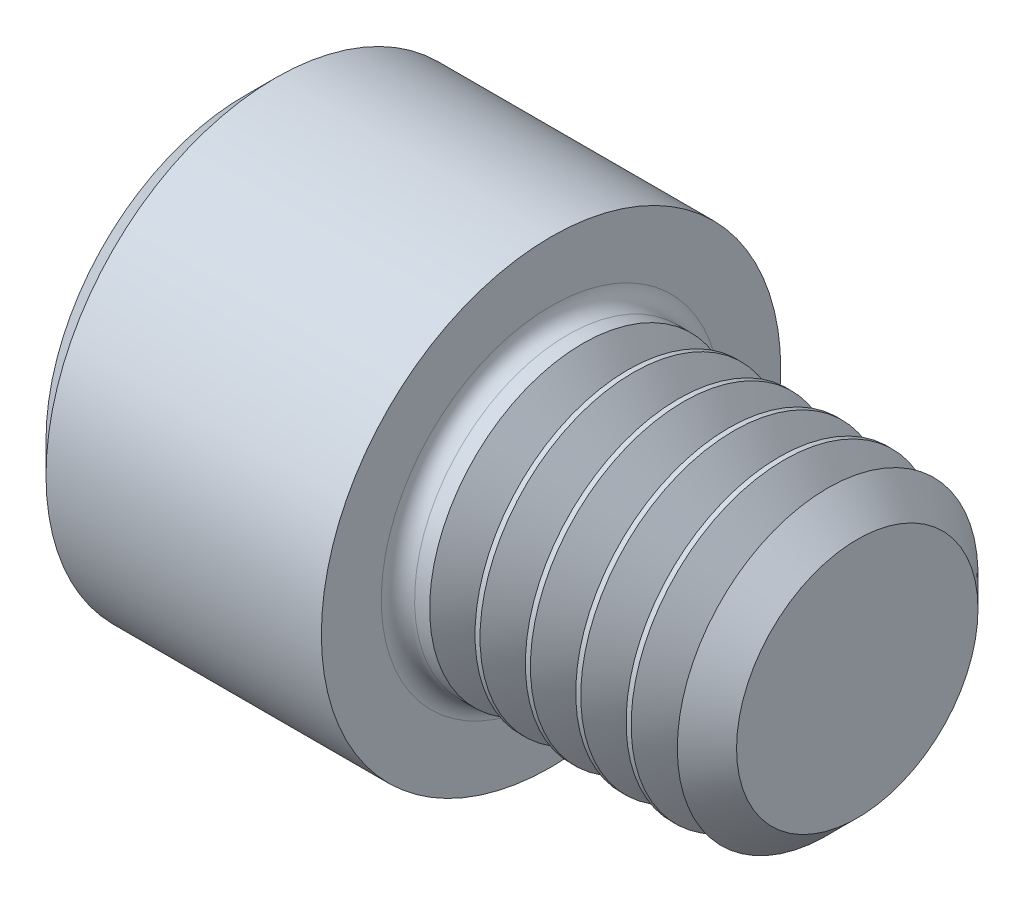
ISO-10303-21;
HEADER;
FILE_DESCRIPTION(('STEP AP214'),'2;1');
FILE_NAME('part.step','',(''),(''),'','','');
FILE_SCHEMA(('AUTOMOTIVE_DESIGN { 1 0 10303 214 1 1 1 1 }'));
ENDSEC;
DATA;
#1=APPLICATION_CONTEXT('core data for automotive mechanical design processes');
#2=APPLICATION_PROTOCOL_DEFINITION('international standard','automotive_design',2000,#1);
#3=PRODUCT_CONTEXT('',#1,'mechanical');
#4=PRODUCT('Part','Part','',(#3));
#5=PRODUCT_RELATED_PRODUCT_CATEGORY('part','',(#4));
#6=PRODUCT_DEFINITION_FORMATION('','',#4);
#7=PRODUCT_DEFINITION_CONTEXT('part definition',#1,'design');
#8=PRODUCT_DEFINITION('design','',#6,#7);
#9=PRODUCT_DEFINITION_SHAPE('','',#8);
#10=(LENGTH_UNIT() NAMED_UNIT(*) SI_UNIT(.MILLI.,.METRE.));
#11=(NAMED_UNIT(*) PLANE_ANGLE_UNIT() SI_UNIT($,.RADIAN.));
#12=(NAMED_UNIT(*) SI_UNIT($,.STERADIAN.) SOLID_ANGLE_UNIT());
#13=UNCERTAINTY_MEASURE_WITH_UNIT(LENGTH_MEASURE(1.E-05),#10,'distance_accuracy_value','');
#14=(GEOMETRIC_REPRESENTATION_CONTEXT(3) GLOBAL_UNCERTAINTY_ASSIGNED_CONTEXT((#13)) GLOBAL_UNIT_ASSIGNED_CONTEXT((#10,
#11,#12)) REPRESENTATION_CONTEXT('',''));
#15=CARTESIAN_POINT('',(0.,0.,0.));
#16=DIRECTION('',(0.,0.,1.));
#17=DIRECTION('',(1.,0.,0.));
#18=AXIS2_PLACEMENT_3D('',#15,#16,#17);
#19=CARTESIAN_POINT('',(0.,0.,0.));
#20=DIRECTION('',(-1.,0.,0.));
#21=DIRECTION('',(0.,0.,1.));
#22=AXIS2_PLACEMENT_3D('',#19,#20,#21);
#23=PLANE('',#22);
#24=DIRECTION('',(0.,-0.499999999999999,0.866025403784439));
#25=VECTOR('',#24,1.);
#26=CARTESIAN_POINT('',(0.,3.66617420935413,0.));
#27=LINE('',#26,#25);
#28=CARTESIAN_POINT('',(0.,3.66617420935413,0.));
#29=VERTEX_POINT('',#28);
#30=CARTESIAN_POINT('',(0.,1.83308710467707,3.175));
#31=VERTEX_POINT('',#30);
#32=EDGE_CURVE('E308',#29,#31,#27,.T.);
#33=ORIENTED_EDGE('',*,*,#32,.T.);
#34=DIRECTION('',(0.,1.,0.));
#35=VECTOR('',#34,1.);
#36=CARTESIAN_POINT('',(0.,-1.83308710467705,3.175));
#37=LINE('',#36,#35);
#38=CARTESIAN_POINT('',(0.,-1.83308710467705,3.175));
#39=VERTEX_POINT('',#38);
#40=EDGE_CURVE('E127',#39,#31,#37,.T.);
#41=ORIENTED_EDGE('',*,*,#40,.F.);
#42=DIRECTION('',(0.,-0.500000000000001,-0.866025403784438));
#43=VECTOR('',#42,1.);
#44=CARTESIAN_POINT('',(0.,-1.83308710467705,3.175));
#45=LINE('',#44,#43);
#46=CARTESIAN_POINT('',(0.,-3.66617420935412,0.));
#47=VERTEX_POINT('',#46);
#48=EDGE_CURVE('E329',#39,#47,#45,.T.);
#49=ORIENTED_EDGE('',*,*,#48,.T.);
#50=DIRECTION('',(0.,0.499999999999999,-0.866025403784439));
#51=VECTOR('',#50,1.);
#52=CARTESIAN_POINT('',(0.,-3.66617420935412,0.));
#53=LINE('',#52,#51);
#54=CARTESIAN_POINT('',(0.,-1.83308710467706,-3.175));
#55=VERTEX_POINT('',#54);
#56=EDGE_CURVE('E332',#47,#55,#53,.T.);
#57=ORIENTED_EDGE('',*,*,#56,.T.);
#58=DIRECTION('',(0.,-1.,0.));
#59=VECTOR('',#58,1.);
#60=CARTESIAN_POINT('',(0.,1.83308710467706,-3.175));
#61=LINE('',#60,#59);
#62=CARTESIAN_POINT('',(0.,1.83308710467706,-3.175));
#63=VERTEX_POINT('',#62);
#64=EDGE_CURVE('E335',#63,#55,#61,.T.);
#65=ORIENTED_EDGE('',*,*,#64,.F.);
#66=DIRECTION('',(0.,-0.500000000000001,-0.866025403784438));
#67=VECTOR('',#66,1.);
#68=CARTESIAN_POINT('',(0.,3.66617420935413,0.));
#69=LINE('',#68,#67);
#70=EDGE_CURVE('E122',#29,#63,#69,.T.);
#71=ORIENTED_EDGE('',*,*,#70,.F.);
#72=EDGE_LOOP('',(#33,#41,#49,#57,#65,#71));
#73=FACE_BOUND('',#72,.T.);
#74=CARTESIAN_POINT('',(0.,0.,0.));
#75=DIRECTION('',(-1.,0.,0.));
#76=DIRECTION('',(0.,0.,1.));
#77=AXIS2_PLACEMENT_3D('',#74,#75,#76);
#78=CIRCLE('',#77,5.15366);
#79=CARTESIAN_POINT('',(0.,0.,5.15366));
#80=VERTEX_POINT('',#79);
#81=EDGE_CURVE('E148',#80,#80,#78,.T.);
#82=ORIENTED_EDGE('',*,*,#81,.T.);
#83=EDGE_LOOP('',(#82));
#84=FACE_BOUND('',#83,.T.);
#85=ADVANCED_FACE('F34',(#73,#84),#23,.T.);
#86=CARTESIAN_POINT('',(0.,0.,0.));
#87=DIRECTION('',(1.,0.,0.));
#88=DIRECTION('',(0.,0.,-1.));
#89=AXIS2_PLACEMENT_3D('',#86,#87,#88);
#90=CONICAL_SURFACE('',#89,5.15366,0.785398163397447);
#91=CARTESIAN_POINT('',(0.800099999999998,0.,0.));
#92=DIRECTION('',(-1.,0.,0.));
#93=DIRECTION('',(0.,0.,1.));
#94=AXIS2_PLACEMENT_3D('',#91,#92,#93);
#95=CIRCLE('',#94,5.95376);
#96=CARTESIAN_POINT('',(0.800099999999998,0.,5.95376));
#97=VERTEX_POINT('',#96);
#98=EDGE_CURVE('E145',#97,#97,#95,.T.);
#99=ORIENTED_EDGE('',*,*,#98,.T.);
#100=EDGE_LOOP('',(#99));
#101=FACE_BOUND('',#100,.T.);
#102=ORIENTED_EDGE('',*,*,#81,.F.);
#103=EDGE_LOOP('',(#102));
#104=FACE_BOUND('',#103,.T.);
#105=ADVANCED_FACE('F171',(#101,#104),#90,.T.);
#106=CARTESIAN_POINT('',(-31.75,0.,0.));
#107=DIRECTION('',(-1.,0.,0.));
#108=DIRECTION('',(0.,0.,1.));
#109=AXIS2_PLACEMENT_3D('',#106,#107,#108);
#110=CYLINDRICAL_SURFACE('',#109,5.95376);
#111=CARTESIAN_POINT('',(7.9375,0.,0.));
#112=DIRECTION('',(-1.,0.,0.));
#113=DIRECTION('',(0.,0.,1.));
#114=AXIS2_PLACEMENT_3D('',#111,#112,#113);
#115=CIRCLE('',#114,5.95376);
#116=CARTESIAN_POINT('',(7.9375,0.,5.95376));
#117=VERTEX_POINT('',#116);
#118=EDGE_CURVE('E142',#117,#117,#115,.T.);
#119=ORIENTED_EDGE('',*,*,#118,.T.);
#120=EDGE_LOOP('',(#119));
#121=FACE_BOUND('',#120,.T.);
#122=ORIENTED_EDGE('',*,*,#98,.F.);
#123=EDGE_LOOP('',(#122));
#124=FACE_BOUND('',#123,.T.);
#125=ADVANCED_FACE('F176',(#121,#124),#110,.T.);
#126=CARTESIAN_POINT('',(7.9375,5.95376,0.));
#127=DIRECTION('',(1.,0.,0.));
#128=DIRECTION('',(0.,0.,-1.));
#129=AXIS2_PLACEMENT_3D('',#126,#127,#128);
#130=PLANE('',#129);
#131=CARTESIAN_POINT('',(7.9375,0.,0.));
#132=DIRECTION('',(1.,0.,0.));
#133=DIRECTION('',(0.,0.,-1.));
#134=AXIS2_PLACEMENT_3D('',#131,#132,#133);
#135=CIRCLE('',#134,4.40054999999998);
#136=CARTESIAN_POINT('',(7.9375,0.,-4.40054999999998));
#137=VERTEX_POINT('',#136);
#138=EDGE_CURVE('E43',#137,#137,#135,.F.);
#139=ORIENTED_EDGE('',*,*,#138,.T.);
#140=EDGE_LOOP('',(#139));
#141=FACE_BOUND('',#140,.T.);
#142=ORIENTED_EDGE('',*,*,#118,.F.);
#143=EDGE_LOOP('',(#142));
#144=FACE_BOUND('',#143,.T.);
#145=ADVANCED_FACE('F154',(#141,#144),#130,.T.);
#146=CARTESIAN_POINT('',(-31.75,0.,0.));
#147=DIRECTION('',(-1.,0.,0.));
#148=DIRECTION('',(0.,0.,1.));
#149=AXIS2_PLACEMENT_3D('',#146,#147,#148);
#150=CYLINDRICAL_SURFACE('',#149,3.96874999999998);
#151=CARTESIAN_POINT('',(8.75939677789909,0.,0.));
#152=DIRECTION('',(-1.,0.,0.));
#153=DIRECTION('',(0.,-1.,0.));
#154=AXIS2_PLACEMENT_3D('',#151,#152,#153);
#155=CIRCLE('',#154,3.96875);
#156=CARTESIAN_POINT('',(8.75939677789909,-3.96875,0.));
#157=VERTEX_POINT('',#156);
#158=EDGE_CURVE('E303',#157,#157,#155,.T.);
#159=ORIENTED_EDGE('',*,*,#158,.T.);
#160=EDGE_LOOP('',(#159));
#161=FACE_BOUND('',#160,.T.);
#162=CARTESIAN_POINT('',(8.3693,0.,0.));
#163=DIRECTION('',(1.,0.,0.));
#164=DIRECTION('',(0.,0.,-1.));
#165=AXIS2_PLACEMENT_3D('',#162,#163,#164);
#166=CIRCLE('',#165,3.96874999999998);
#167=CARTESIAN_POINT('',(8.3693,0.,-3.96874999999998));
#168=VERTEX_POINT('',#167);
#169=EDGE_CURVE('E11',#168,#168,#166,.T.);
#170=ORIENTED_EDGE('',*,*,#169,.T.);
#171=EDGE_LOOP('',(#170));
#172=FACE_BOUND('',#171,.T.);
#173=ADVANCED_FACE('F158',(#161,#172),#150,.T.);
#174=CARTESIAN_POINT('',(8.3693,0.,0.));
#175=DIRECTION('',(1.,0.,0.));
#176=DIRECTION('',(0.,0.,-1.));
#177=AXIS2_PLACEMENT_3D('',#174,#175,#176);
#178=TOROIDAL_SURFACE('',#177,4.40054999999998,0.4318);
#179=ORIENTED_EDGE('',*,*,#169,.F.);
#180=EDGE_LOOP('',(#179));
#181=FACE_BOUND('',#180,.T.);
#182=ORIENTED_EDGE('',*,*,#138,.F.);
#183=EDGE_LOOP('',(#182));
#184=FACE_BOUND('',#183,.T.);
#185=ADVANCED_FACE('F36',(#181,#184),#178,.F.);
#186=CARTESIAN_POINT('',(3.8354,3.66617420935413,0.));
#187=DIRECTION('',(0.,-0.86602540378444,-0.499999999999999));
#188=DIRECTION('',(0.,0.499999999999999,-0.86602540378444));
#189=AXIS2_PLACEMENT_3D('',#186,#187,#188);
#190=PLANE('',#189);
#191=ORIENTED_EDGE('',*,*,#32,.F.);
#192=DIRECTION('',(-1.,0.,0.));
#193=VECTOR('',#192,1.);
#194=CARTESIAN_POINT('',(3.8354,3.66617420935413,0.));
#195=LINE('',#194,#193);
#196=CARTESIAN_POINT('',(3.8354,3.66617420935413,0.));
#197=VERTEX_POINT('',#196);
#198=EDGE_CURVE('E326',#197,#29,#195,.T.);
#199=ORIENTED_EDGE('',*,*,#198,.F.);
#200=DIRECTION('',(0.,-0.499999999999999,0.866025403784439));
#201=VECTOR('',#200,1.);
#202=CARTESIAN_POINT('',(3.8354,3.66617420935413,0.));
#203=LINE('',#202,#201);
#204=CARTESIAN_POINT('',(3.8354,2.7496306570156,1.5875));
#205=VERTEX_POINT('',#204);
#206=EDGE_CURVE('E50',#197,#205,#203,.T.);
#207=ORIENTED_EDGE('',*,*,#206,.T.);
#208=CARTESIAN_POINT('',(3.8354,1.83308710467707,3.175));
#209=VERTEX_POINT('',#208);
#210=EDGE_CURVE('E108',#205,#209,#203,.T.);
#211=ORIENTED_EDGE('',*,*,#210,.T.);
#212=DIRECTION('',(-1.,0.,0.));
#213=VECTOR('',#212,1.);
#214=CARTESIAN_POINT('',(3.8354,1.83308710467707,3.175));
#215=LINE('',#214,#213);
#216=EDGE_CURVE('E120',#209,#31,#215,.T.);
#217=ORIENTED_EDGE('',*,*,#216,.T.);
#218=EDGE_LOOP('',(#191,#199,#207,#211,#217));
#219=FACE_BOUND('',#218,.T.);
#220=ADVANCED_FACE('F119',(#219),#190,.T.);
#221=CARTESIAN_POINT('',(3.8354,-1.83308710467705,3.175));
#222=DIRECTION('',(0.,0.,1.));
#223=DIRECTION('',(0.,-1.,0.));
#224=AXIS2_PLACEMENT_3D('',#221,#222,#223);
#225=PLANE('',#224);
#226=ORIENTED_EDGE('',*,*,#40,.T.);
#227=ORIENTED_EDGE('',*,*,#216,.F.);
#228=DIRECTION('',(0.,1.,0.));
#229=VECTOR('',#228,1.);
#230=CARTESIAN_POINT('',(3.8354,-1.83308710467705,3.175));
#231=LINE('',#230,#229);
#232=CARTESIAN_POINT('',(3.8354,0.,3.175));
#233=VERTEX_POINT('',#232);
#234=EDGE_CURVE('E106',#233,#209,#231,.T.);
#235=ORIENTED_EDGE('',*,*,#234,.F.);
#236=CARTESIAN_POINT('',(3.8354,-1.83308710467705,3.175));
#237=VERTEX_POINT('',#236);
#238=EDGE_CURVE('E116',#237,#233,#231,.T.);
#239=ORIENTED_EDGE('',*,*,#238,.F.);
#240=DIRECTION('',(-1.,0.,0.));
#241=VECTOR('',#240,1.);
#242=CARTESIAN_POINT('',(3.8354,-1.83308710467705,3.175));
#243=LINE('',#242,#241);
#244=EDGE_CURVE('E129',#237,#39,#243,.T.);
#245=ORIENTED_EDGE('',*,*,#244,.T.);
#246=EDGE_LOOP('',(#226,#227,#235,#239,#245));
#247=FACE_BOUND('',#246,.T.);
#248=ADVANCED_FACE('F124',(#247),#225,.F.);
#249=CARTESIAN_POINT('',(3.8354,-1.83308710467705,3.175));
#250=DIRECTION('',(0.,0.866025403784438,-0.500000000000001));
#251=DIRECTION('',(0.,0.500000000000001,0.866025403784438));
#252=AXIS2_PLACEMENT_3D('',#249,#250,#251);
#253=PLANE('',#252);
#254=ORIENTED_EDGE('',*,*,#48,.F.);
#255=ORIENTED_EDGE('',*,*,#244,.F.);
#256=DIRECTION('',(0.,-0.500000000000001,-0.866025403784438));
#257=VECTOR('',#256,1.);
#258=CARTESIAN_POINT('',(3.8354,-1.83308710467705,3.175));
#259=LINE('',#258,#257);
#260=CARTESIAN_POINT('',(3.8354,-2.74963065701559,1.5875));
#261=VERTEX_POINT('',#260);
#262=EDGE_CURVE('E311',#237,#261,#259,.T.);
#263=ORIENTED_EDGE('',*,*,#262,.T.);
#264=CARTESIAN_POINT('',(3.8354,-3.66617420935412,0.));
#265=VERTEX_POINT('',#264);
#266=EDGE_CURVE('E310',#261,#265,#259,.T.);
#267=ORIENTED_EDGE('',*,*,#266,.T.);
#268=DIRECTION('',(-1.,0.,0.));
#269=VECTOR('',#268,1.);
#270=CARTESIAN_POINT('',(3.8354,-3.66617420935412,0.));
#271=LINE('',#270,#269);
#272=EDGE_CURVE('E134',#265,#47,#271,.T.);
#273=ORIENTED_EDGE('',*,*,#272,.T.);
#274=EDGE_LOOP('',(#254,#255,#263,#267,#273));
#275=FACE_BOUND('',#274,.T.);
#276=ADVANCED_FACE('F201',(#275),#253,.T.);
#277=CARTESIAN_POINT('',(3.8354,-3.66617420935412,0.));
#278=DIRECTION('',(0.,0.866025403784439,0.499999999999999));
#279=DIRECTION('',(0.,-0.499999999999999,0.866025403784439));
#280=AXIS2_PLACEMENT_3D('',#277,#278,#279);
#281=PLANE('',#280);
#282=ORIENTED_EDGE('',*,*,#56,.F.);
#283=ORIENTED_EDGE('',*,*,#272,.F.);
#284=DIRECTION('',(0.,0.499999999999999,-0.866025403784439));
#285=VECTOR('',#284,1.);
#286=CARTESIAN_POINT('',(3.8354,-3.66617420935412,0.));
#287=LINE('',#286,#285);
#288=CARTESIAN_POINT('',(3.8354,-2.74963065701559,-1.58749999999999));
#289=VERTEX_POINT('',#288);
#290=EDGE_CURVE('E315',#265,#289,#287,.T.);
#291=ORIENTED_EDGE('',*,*,#290,.T.);
#292=CARTESIAN_POINT('',(3.8354,-1.83308710467706,-3.175));
#293=VERTEX_POINT('',#292);
#294=EDGE_CURVE('E314',#289,#293,#287,.T.);
#295=ORIENTED_EDGE('',*,*,#294,.T.);
#296=DIRECTION('',(-1.,0.,0.));
#297=VECTOR('',#296,1.);
#298=CARTESIAN_POINT('',(3.8354,-1.83308710467706,-3.175));
#299=LINE('',#298,#297);
#300=EDGE_CURVE('E344',#293,#55,#299,.T.);
#301=ORIENTED_EDGE('',*,*,#300,.T.);
#302=EDGE_LOOP('',(#282,#283,#291,#295,#301));
#303=FACE_BOUND('',#302,.T.);
#304=ADVANCED_FACE('F204',(#303),#281,.T.);
#305=CARTESIAN_POINT('',(3.8354,1.83308710467706,-3.175));
#306=DIRECTION('',(0.,0.,-1.));
#307=DIRECTION('',(0.,1.,0.));
#308=AXIS2_PLACEMENT_3D('',#305,#306,#307);
#309=PLANE('',#308);
#310=ORIENTED_EDGE('',*,*,#64,.T.);
#311=ORIENTED_EDGE('',*,*,#300,.F.);
#312=DIRECTION('',(0.,-1.,0.));
#313=VECTOR('',#312,1.);
#314=CARTESIAN_POINT('',(3.8354,1.83308710467706,-3.175));
#315=LINE('',#314,#313);
#316=CARTESIAN_POINT('',(3.8354,0.,-3.175));
#317=VERTEX_POINT('',#316);
#318=EDGE_CURVE('E318',#317,#293,#315,.T.);
#319=ORIENTED_EDGE('',*,*,#318,.F.);
#320=CARTESIAN_POINT('',(3.8354,1.83308710467706,-3.175));
#321=VERTEX_POINT('',#320);
#322=EDGE_CURVE('E319',#321,#317,#315,.T.);
#323=ORIENTED_EDGE('',*,*,#322,.F.);
#324=DIRECTION('',(-1.,0.,0.));
#325=VECTOR('',#324,1.);
#326=CARTESIAN_POINT('',(3.8354,1.83308710467706,-3.175));
#327=LINE('',#326,#325);
#328=EDGE_CURVE('E341',#321,#63,#327,.T.);
#329=ORIENTED_EDGE('',*,*,#328,.T.);
#330=EDGE_LOOP('',(#310,#311,#319,#323,#329));
#331=FACE_BOUND('',#330,.T.);
#332=ADVANCED_FACE('F208',(#331),#309,.F.);
#333=CARTESIAN_POINT('',(3.8354,3.66617420935413,0.));
#334=DIRECTION('',(0.,0.866025403784438,-0.500000000000001));
#335=DIRECTION('',(0.,0.500000000000001,0.866025403784438));
#336=AXIS2_PLACEMENT_3D('',#333,#334,#335);
#337=PLANE('',#336);
#338=ORIENTED_EDGE('',*,*,#70,.T.);
#339=ORIENTED_EDGE('',*,*,#328,.F.);
#340=DIRECTION('',(0.,-0.500000000000001,-0.866025403784438));
#341=VECTOR('',#340,1.);
#342=CARTESIAN_POINT('',(3.8354,3.66617420935413,0.));
#343=LINE('',#342,#341);
#344=CARTESIAN_POINT('',(3.8354,2.74963065701559,-1.58750000000001));
#345=VERTEX_POINT('',#344);
#346=EDGE_CURVE('E322',#345,#321,#343,.T.);
#347=ORIENTED_EDGE('',*,*,#346,.F.);
#348=EDGE_CURVE('E323',#197,#345,#343,.T.);
#349=ORIENTED_EDGE('',*,*,#348,.F.);
#350=ORIENTED_EDGE('',*,*,#198,.T.);
#351=EDGE_LOOP('',(#338,#339,#347,#349,#350));
#352=FACE_BOUND('',#351,.T.);
#353=ADVANCED_FACE('F212',(#352),#337,.F.);
#354=CARTESIAN_POINT('',(3.8354,1.83308710467707,3.175));
#355=DIRECTION('',(-1.,0.,0.));
#356=DIRECTION('',(0.,0.,1.));
#357=AXIS2_PLACEMENT_3D('',#354,#355,#356);
#358=PLANE('',#357);
#359=CARTESIAN_POINT('',(3.8354,0.,0.));
#360=DIRECTION('',(-1.,0.,0.));
#361=DIRECTION('',(0.,0.,1.));
#362=AXIS2_PLACEMENT_3D('',#359,#360,#361);
#363=CIRCLE('',#362,3.175);
#364=EDGE_CURVE('E128',#261,#233,#363,.T.);
#365=ORIENTED_EDGE('',*,*,#364,.F.);
#366=ORIENTED_EDGE('',*,*,#262,.F.);
#367=ORIENTED_EDGE('',*,*,#238,.T.);
#368=EDGE_LOOP('',(#365,#366,#367));
#369=FACE_BOUND('',#368,.T.);
#370=ADVANCED_FACE('F216',(#369),#358,.T.);
#371=EDGE_CURVE('E132',#289,#261,#363,.T.);
#372=ORIENTED_EDGE('',*,*,#371,.F.);
#373=ORIENTED_EDGE('',*,*,#290,.F.);
#374=ORIENTED_EDGE('',*,*,#266,.F.);
#375=EDGE_LOOP('',(#372,#373,#374));
#376=FACE_BOUND('',#375,.T.);
#377=ADVANCED_FACE('F220',(#376),#358,.T.);
#378=EDGE_CURVE('E364',#317,#289,#363,.T.);
#379=ORIENTED_EDGE('',*,*,#378,.F.);
#380=ORIENTED_EDGE('',*,*,#318,.T.);
#381=ORIENTED_EDGE('',*,*,#294,.F.);
#382=EDGE_LOOP('',(#379,#380,#381));
#383=FACE_BOUND('',#382,.T.);
#384=ADVANCED_FACE('F370',(#383),#358,.T.);
#385=EDGE_CURVE('E361',#345,#317,#363,.T.);
#386=ORIENTED_EDGE('',*,*,#385,.F.);
#387=ORIENTED_EDGE('',*,*,#346,.T.);
#388=ORIENTED_EDGE('',*,*,#322,.T.);
#389=EDGE_LOOP('',(#386,#387,#388));
#390=FACE_BOUND('',#389,.T.);
#391=ADVANCED_FACE('F359',(#390),#358,.T.);
#392=EDGE_CURVE('E139',#205,#345,#363,.T.);
#393=ORIENTED_EDGE('',*,*,#392,.F.);
#394=ORIENTED_EDGE('',*,*,#206,.F.);
#395=ORIENTED_EDGE('',*,*,#348,.T.);
#396=EDGE_LOOP('',(#393,#394,#395));
#397=FACE_BOUND('',#396,.T.);
#398=ADVANCED_FACE('F353',(#397),#358,.T.);
#399=EDGE_CURVE('E111',#233,#205,#363,.T.);
#400=ORIENTED_EDGE('',*,*,#399,.F.);
#401=ORIENTED_EDGE('',*,*,#234,.T.);
#402=ORIENTED_EDGE('',*,*,#210,.F.);
#403=EDGE_LOOP('',(#400,#401,#402));
#404=FACE_BOUND('',#403,.T.);
#405=ADVANCED_FACE('F107',(#404),#358,.T.);
#406=CARTESIAN_POINT('',(3.8354,0.,0.));
#407=DIRECTION('',(-1.,0.,0.));
#408=DIRECTION('',(0.,0.,1.));
#409=AXIS2_PLACEMENT_3D('',#406,#407,#408);
#410=CONICAL_SURFACE('',#409,3.175,1.04719755119659);
#411=CARTESIAN_POINT('',(5.66848710467709,0.,0.));
#412=VERTEX_POINT('',#411);
#413=VERTEX_LOOP('',#412);
#414=FACE_BOUND('',#413,.T.);
#415=ORIENTED_EDGE('',*,*,#399,.T.);
#416=ORIENTED_EDGE('',*,*,#392,.T.);
#417=ORIENTED_EDGE('',*,*,#385,.T.);
#418=ORIENTED_EDGE('',*,*,#378,.T.);
#419=ORIENTED_EDGE('',*,*,#371,.T.);
#420=ORIENTED_EDGE('',*,*,#364,.T.);
#421=EDGE_LOOP('',(#415,#416,#417,#418,#419,#420));
#422=FACE_BOUND('',#421,.T.);
#423=ADVANCED_FACE('F195',(#414,#422),#410,.F.);
#424=CARTESIAN_POINT('',(9.9350032221009,0.,0.));
#425=DIRECTION('',(1.,0.,0.));
#426=DIRECTION('',(0.,1.,0.));
#427=AXIS2_PLACEMENT_3D('',#424,#425,#426);
#428=CONICAL_SURFACE('',#427,3.96875,0.959931088596884);
#429=CARTESIAN_POINT('',(9.3472,0.,0.));
#430=DIRECTION('',(-1.,0.,0.));
#431=DIRECTION('',(0.,-1.,0.));
#432=AXIS2_PLACEMENT_3D('',#429,#430,#431);
#433=CIRCLE('',#432,3.12928);
#434=CARTESIAN_POINT('',(9.3472,-3.12928,0.));
#435=VERTEX_POINT('',#434);
#436=EDGE_CURVE('E300',#435,#435,#433,.T.);
#437=ORIENTED_EDGE('',*,*,#436,.F.);
#438=EDGE_LOOP('',(#437));
#439=FACE_BOUND('',#438,.T.);
#440=CARTESIAN_POINT('',(9.9350032221009,0.,0.));
#441=DIRECTION('',(-1.,0.,0.));
#442=DIRECTION('',(0.,-1.,0.));
#443=AXIS2_PLACEMENT_3D('',#440,#441,#442);
#444=CIRCLE('',#443,3.96875);
#445=CARTESIAN_POINT('',(9.9350032221009,-3.96875,0.));
#446=VERTEX_POINT('',#445);
#447=EDGE_CURVE('E306',#446,#446,#444,.T.);
#448=ORIENTED_EDGE('',*,*,#447,.T.);
#449=EDGE_LOOP('',(#448));
#450=FACE_BOUND('',#449,.T.);
#451=ADVANCED_FACE('F197',(#439,#450),#428,.T.);
#452=CARTESIAN_POINT('',(9.3472,0.,0.));
#453=DIRECTION('',(-1.,0.,0.));
#454=DIRECTION('',(0.,-1.,0.));
#455=AXIS2_PLACEMENT_3D('',#452,#453,#454);
#456=CONICAL_SURFACE('',#455,3.12928,0.959931088596877);
#457=ORIENTED_EDGE('',*,*,#158,.F.);
#458=EDGE_LOOP('',(#457));
#459=FACE_BOUND('',#458,.T.);
#460=ORIENTED_EDGE('',*,*,#436,.T.);
#461=EDGE_LOOP('',(#460));
#462=FACE_BOUND('',#461,.T.);
#463=ADVANCED_FACE('F224',(#459,#462),#456,.T.);
#464=CARTESIAN_POINT('',(10.0649567778991,0.,0.));
#465=DIRECTION('',(-1.,0.,0.));
#466=DIRECTION('',(0.,-1.,0.));
#467=AXIS2_PLACEMENT_3D('',#464,#465,#466);
#468=CIRCLE('',#467,3.96875);
#469=CARTESIAN_POINT('',(10.0649567778991,-3.96875,0.));
#470=VERTEX_POINT('',#469);
#471=EDGE_CURVE('E294',#470,#470,#468,.T.);
#472=ORIENTED_EDGE('',*,*,#471,.T.);
#473=EDGE_LOOP('',(#472));
#474=FACE_BOUND('',#473,.T.);
#475=ORIENTED_EDGE('',*,*,#447,.F.);
#476=EDGE_LOOP('',(#475));
#477=FACE_BOUND('',#476,.T.);
#478=ADVANCED_FACE('F168',(#474,#477),#150,.T.);
#479=CARTESIAN_POINT('',(11.2405632221009,0.,0.));
#480=DIRECTION('',(1.,0.,0.));
#481=DIRECTION('',(0.,1.,0.));
#482=AXIS2_PLACEMENT_3D('',#479,#480,#481);
#483=CONICAL_SURFACE('',#482,3.96875,0.959931088596884);
#484=CARTESIAN_POINT('',(10.65276,0.,0.));
#485=DIRECTION('',(-1.,0.,0.));
#486=DIRECTION('',(0.,-1.,0.));
#487=AXIS2_PLACEMENT_3D('',#484,#485,#486);
#488=CIRCLE('',#487,3.12928);
#489=CARTESIAN_POINT('',(10.65276,-3.12928,0.));
#490=VERTEX_POINT('',#489);
#491=EDGE_CURVE('E291',#490,#490,#488,.T.);
#492=ORIENTED_EDGE('',*,*,#491,.F.);
#493=EDGE_LOOP('',(#492));
#494=FACE_BOUND('',#493,.T.);
#495=CARTESIAN_POINT('',(11.2405632221009,0.,0.));
#496=DIRECTION('',(-1.,0.,0.));
#497=DIRECTION('',(0.,-1.,0.));
#498=AXIS2_PLACEMENT_3D('',#495,#496,#497);
#499=CIRCLE('',#498,3.96875);
#500=CARTESIAN_POINT('',(11.2405632221009,-3.96875,0.));
#501=VERTEX_POINT('',#500);
#502=EDGE_CURVE('E297',#501,#501,#499,.T.);
#503=ORIENTED_EDGE('',*,*,#502,.T.);
#504=EDGE_LOOP('',(#503));
#505=FACE_BOUND('',#504,.T.);
#506=ADVANCED_FACE('F229',(#494,#505),#483,.T.);
#507=CARTESIAN_POINT('',(10.65276,0.,0.));
#508=DIRECTION('',(-1.,0.,0.));
#509=DIRECTION('',(0.,-1.,0.));
#510=AXIS2_PLACEMENT_3D('',#507,#508,#509);
#511=CONICAL_SURFACE('',#510,3.12928,0.959931088596877);
#512=ORIENTED_EDGE('',*,*,#471,.F.);
#513=EDGE_LOOP('',(#512));
#514=FACE_BOUND('',#513,.T.);
#515=ORIENTED_EDGE('',*,*,#491,.T.);
#516=EDGE_LOOP('',(#515));
#517=FACE_BOUND('',#516,.T.);
#518=ADVANCED_FACE('F232',(#514,#517),#511,.T.);
#519=CARTESIAN_POINT('',(11.3705167778991,0.,0.));
#520=DIRECTION('',(-1.,0.,0.));
#521=DIRECTION('',(0.,-1.,0.));
#522=AXIS2_PLACEMENT_3D('',#519,#520,#521);
#523=CIRCLE('',#522,3.96875);
#524=CARTESIAN_POINT('',(11.3705167778991,-3.96875,0.));
#525=VERTEX_POINT('',#524);
#526=EDGE_CURVE('E285',#525,#525,#523,.T.);
#527=ORIENTED_EDGE('',*,*,#526,.T.);
#528=EDGE_LOOP('',(#527));
#529=FACE_BOUND('',#528,.T.);
#530=ORIENTED_EDGE('',*,*,#502,.F.);
#531=EDGE_LOOP('',(#530));
#532=FACE_BOUND('',#531,.T.);
#533=ADVANCED_FACE('F236',(#529,#532),#150,.T.);
#534=CARTESIAN_POINT('',(12.5461232221009,0.,0.));
#535=DIRECTION('',(1.,0.,0.));
#536=DIRECTION('',(0.,1.,0.));
#537=AXIS2_PLACEMENT_3D('',#534,#535,#536);
#538=CONICAL_SURFACE('',#537,3.96875,0.959931088596884);
#539=CARTESIAN_POINT('',(11.95832,0.,0.));
#540=DIRECTION('',(-1.,0.,0.));
#541=DIRECTION('',(0.,-1.,0.));
#542=AXIS2_PLACEMENT_3D('',#539,#540,#541);
#543=CIRCLE('',#542,3.12928);
#544=CARTESIAN_POINT('',(11.95832,-3.12928,0.));
#545=VERTEX_POINT('',#544);
#546=EDGE_CURVE('E282',#545,#545,#543,.T.);
#547=ORIENTED_EDGE('',*,*,#546,.F.);
#548=EDGE_LOOP('',(#547));
#549=FACE_BOUND('',#548,.T.);
#550=CARTESIAN_POINT('',(12.5461232221009,0.,0.));
#551=DIRECTION('',(-1.,0.,0.));
#552=DIRECTION('',(0.,-1.,0.));
#553=AXIS2_PLACEMENT_3D('',#550,#551,#552);
#554=CIRCLE('',#553,3.96875);
#555=CARTESIAN_POINT('',(12.5461232221009,-3.96875,0.));
#556=VERTEX_POINT('',#555);
#557=EDGE_CURVE('E288',#556,#556,#554,.T.);
#558=ORIENTED_EDGE('',*,*,#557,.T.);
#559=EDGE_LOOP('',(#558));
#560=FACE_BOUND('',#559,.T.);
#561=ADVANCED_FACE('F238',(#549,#560),#538,.T.);
#562=CARTESIAN_POINT('',(11.95832,0.,0.));
#563=DIRECTION('',(-1.,0.,0.));
#564=DIRECTION('',(0.,-1.,0.));
#565=AXIS2_PLACEMENT_3D('',#562,#563,#564);
#566=CONICAL_SURFACE('',#565,3.12928,0.959931088596877);
#567=ORIENTED_EDGE('',*,*,#526,.F.);
#568=EDGE_LOOP('',(#567));
#569=FACE_BOUND('',#568,.T.);
#570=ORIENTED_EDGE('',*,*,#546,.T.);
#571=EDGE_LOOP('',(#570));
#572=FACE_BOUND('',#571,.T.);
#573=ADVANCED_FACE('F241',(#569,#572),#566,.T.);
#574=CARTESIAN_POINT('',(12.6760767778991,0.,0.));
#575=DIRECTION('',(-1.,0.,0.));
#576=DIRECTION('',(0.,-1.,0.));
#577=AXIS2_PLACEMENT_3D('',#574,#575,#576);
#578=CIRCLE('',#577,3.96875);
#579=CARTESIAN_POINT('',(12.6760767778991,-3.96875,0.));
#580=VERTEX_POINT('',#579);
#581=EDGE_CURVE('E276',#580,#580,#578,.T.);
#582=ORIENTED_EDGE('',*,*,#581,.T.);
#583=EDGE_LOOP('',(#582));
#584=FACE_BOUND('',#583,.T.);
#585=ORIENTED_EDGE('',*,*,#557,.F.);
#586=EDGE_LOOP('',(#585));
#587=FACE_BOUND('',#586,.T.);
#588=ADVANCED_FACE('F245',(#584,#587),#150,.T.);
#589=CARTESIAN_POINT('',(13.8516832221009,0.,0.));
#590=DIRECTION('',(1.,0.,0.));
#591=DIRECTION('',(0.,1.,0.));
#592=AXIS2_PLACEMENT_3D('',#589,#590,#591);
#593=CONICAL_SURFACE('',#592,3.96875,0.959931088596884);
#594=CARTESIAN_POINT('',(13.26388,0.,0.));
#595=DIRECTION('',(-1.,0.,0.));
#596=DIRECTION('',(0.,-1.,0.));
#597=AXIS2_PLACEMENT_3D('',#594,#595,#596);
#598=CIRCLE('',#597,3.12928);
#599=CARTESIAN_POINT('',(13.26388,-3.12928,0.));
#600=VERTEX_POINT('',#599);
#601=EDGE_CURVE('E273',#600,#600,#598,.T.);
#602=ORIENTED_EDGE('',*,*,#601,.F.);
#603=EDGE_LOOP('',(#602));
#604=FACE_BOUND('',#603,.T.);
#605=CARTESIAN_POINT('',(13.8516832221009,0.,0.));
#606=DIRECTION('',(-1.,0.,0.));
#607=DIRECTION('',(0.,-1.,0.));
#608=AXIS2_PLACEMENT_3D('',#605,#606,#607);
#609=CIRCLE('',#608,3.96875);
#610=CARTESIAN_POINT('',(13.8516832221009,-3.96875,0.));
#611=VERTEX_POINT('',#610);
#612=EDGE_CURVE('E279',#611,#611,#609,.T.);
#613=ORIENTED_EDGE('',*,*,#612,.T.);
#614=EDGE_LOOP('',(#613));
#615=FACE_BOUND('',#614,.T.);
#616=ADVANCED_FACE('F247',(#604,#615),#593,.T.);
#617=CARTESIAN_POINT('',(13.26388,0.,0.));
#618=DIRECTION('',(-1.,0.,0.));
#619=DIRECTION('',(0.,-1.,0.));
#620=AXIS2_PLACEMENT_3D('',#617,#618,#619);
#621=CONICAL_SURFACE('',#620,3.12928,0.959931088596877);
#622=ORIENTED_EDGE('',*,*,#581,.F.);
#623=EDGE_LOOP('',(#622));
#624=FACE_BOUND('',#623,.T.);
#625=ORIENTED_EDGE('',*,*,#601,.T.);
#626=EDGE_LOOP('',(#625));
#627=FACE_BOUND('',#626,.T.);
#628=ADVANCED_FACE('F250',(#624,#627),#621,.T.);
#629=CARTESIAN_POINT('',(13.9816367778991,0.,0.));
#630=DIRECTION('',(-1.,0.,0.));
#631=DIRECTION('',(0.,-1.,0.));
#632=AXIS2_PLACEMENT_3D('',#629,#630,#631);
#633=CIRCLE('',#632,3.96875);
#634=CARTESIAN_POINT('',(13.9816367778991,-3.96875,0.));
#635=VERTEX_POINT('',#634);
#636=EDGE_CURVE('E266',#635,#635,#633,.T.);
#637=ORIENTED_EDGE('',*,*,#636,.T.);
#638=EDGE_LOOP('',(#637));
#639=FACE_BOUND('',#638,.T.);
#640=ORIENTED_EDGE('',*,*,#612,.F.);
#641=EDGE_LOOP('',(#640));
#642=FACE_BOUND('',#641,.T.);
#643=ADVANCED_FACE('F167',(#639,#642),#150,.T.);
#644=CARTESIAN_POINT('',(15.1572432221009,0.,0.));
#645=DIRECTION('',(1.,0.,0.));
#646=DIRECTION('',(0.,1.,0.));
#647=AXIS2_PLACEMENT_3D('',#644,#645,#646);
#648=CONICAL_SURFACE('',#647,3.96875,0.959931088596884);
#649=CARTESIAN_POINT('',(14.56944,0.,0.));
#650=DIRECTION('',(-1.,0.,0.));
#651=DIRECTION('',(0.,-1.,0.));
#652=AXIS2_PLACEMENT_3D('',#649,#650,#651);
#653=CIRCLE('',#652,3.12928);
#654=CARTESIAN_POINT('',(14.56944,-3.12928,0.));
#655=VERTEX_POINT('',#654);
#656=EDGE_CURVE('E269',#655,#655,#653,.T.);
#657=ORIENTED_EDGE('',*,*,#656,.F.);
#658=EDGE_LOOP('',(#657));
#659=FACE_BOUND('',#658,.T.);
#660=CARTESIAN_POINT('',(15.1071172735331,0.,0.));
#661=DIRECTION('',(1.,0.,0.));
#662=DIRECTION('',(0.,1.,0.));
#663=AXIS2_PLACEMENT_3D('',#660,#661,#662);
#664=CIRCLE('',#663,3.89716272646684);
#665=CARTESIAN_POINT('',(15.1071172735331,3.89716272646684,0.));
#666=VERTEX_POINT('',#665);
#667=EDGE_CURVE('E38',#666,#666,#664,.T.);
#668=ORIENTED_EDGE('',*,*,#667,.F.);
#669=EDGE_LOOP('',(#668));
#670=FACE_BOUND('',#669,.T.);
#671=ADVANCED_FACE('F255',(#659,#670),#648,.T.);
#672=CARTESIAN_POINT('',(14.56944,0.,0.));
#673=DIRECTION('',(-1.,0.,0.));
#674=DIRECTION('',(0.,-1.,0.));
#675=AXIS2_PLACEMENT_3D('',#672,#673,#674);
#676=CONICAL_SURFACE('',#675,3.12928,0.959931088596877);
#677=ORIENTED_EDGE('',*,*,#636,.F.);
#678=EDGE_LOOP('',(#677));
#679=FACE_BOUND('',#678,.T.);
#680=ORIENTED_EDGE('',*,*,#656,.T.);
#681=EDGE_LOOP('',(#680));
#682=FACE_BOUND('',#681,.T.);
#683=ADVANCED_FACE('F193',(#679,#682),#676,.T.);
#684=CARTESIAN_POINT('',(15.875,3.12928,0.));
#685=DIRECTION('',(1.,0.,0.));
#686=DIRECTION('',(0.,0.,-1.));
#687=AXIS2_PLACEMENT_3D('',#684,#685,#686);
#688=PLANE('',#687);
#689=CARTESIAN_POINT('',(15.875,0.,0.));
#690=DIRECTION('',(-1.,0.,0.));
#691=DIRECTION('',(0.,0.,1.));
#692=AXIS2_PLACEMENT_3D('',#689,#690,#691);
#693=CIRCLE('',#692,3.12928);
#694=CARTESIAN_POINT('',(15.875,0.,3.12928));
#695=VERTEX_POINT('',#694);
#696=EDGE_CURVE('E138',#695,#695,#693,.T.);
#697=ORIENTED_EDGE('',*,*,#696,.F.);
#698=EDGE_LOOP('',(#697));
#699=FACE_BOUND('',#698,.T.);
#700=ADVANCED_FACE('F189',(#699),#688,.T.);
#701=CARTESIAN_POINT('',(15.875,0.,0.));
#702=DIRECTION('',(-1.,0.,0.));
#703=DIRECTION('',(0.,0.,1.));
#704=AXIS2_PLACEMENT_3D('',#701,#702,#703);
#705=CONICAL_SURFACE('',#704,3.12928,0.785398163397408);
#706=ORIENTED_EDGE('',*,*,#667,.T.);
#707=EDGE_LOOP('',(#706));
#708=FACE_BOUND('',#707,.T.);
#709=ORIENTED_EDGE('',*,*,#696,.T.);
#710=EDGE_LOOP('',(#709));
#711=FACE_BOUND('',#710,.T.);
#712=ADVANCED_FACE('F186',(#708,#711),#705,.T.);
#713=CLOSED_SHELL('',(#85,#105,#125,#145,#173,#185,#220,#248,#276,#304,#332,#353,#370,#377,#384,
#391,#398,#405,#423,#451,#463,#478,#506,#518,#533,#561,#573,#588,#616,#628,#643,#671,#683,#700,#712));
#714=MANIFOLD_SOLID_BREP('B2',#713);
#715=ADVANCED_BREP_SHAPE_REPRESENTATION('',(#18,#714),#14);
#716=SHAPE_DEFINITION_REPRESENTATION(#9,#715);
ENDSEC;
END-ISO-10303-21;
